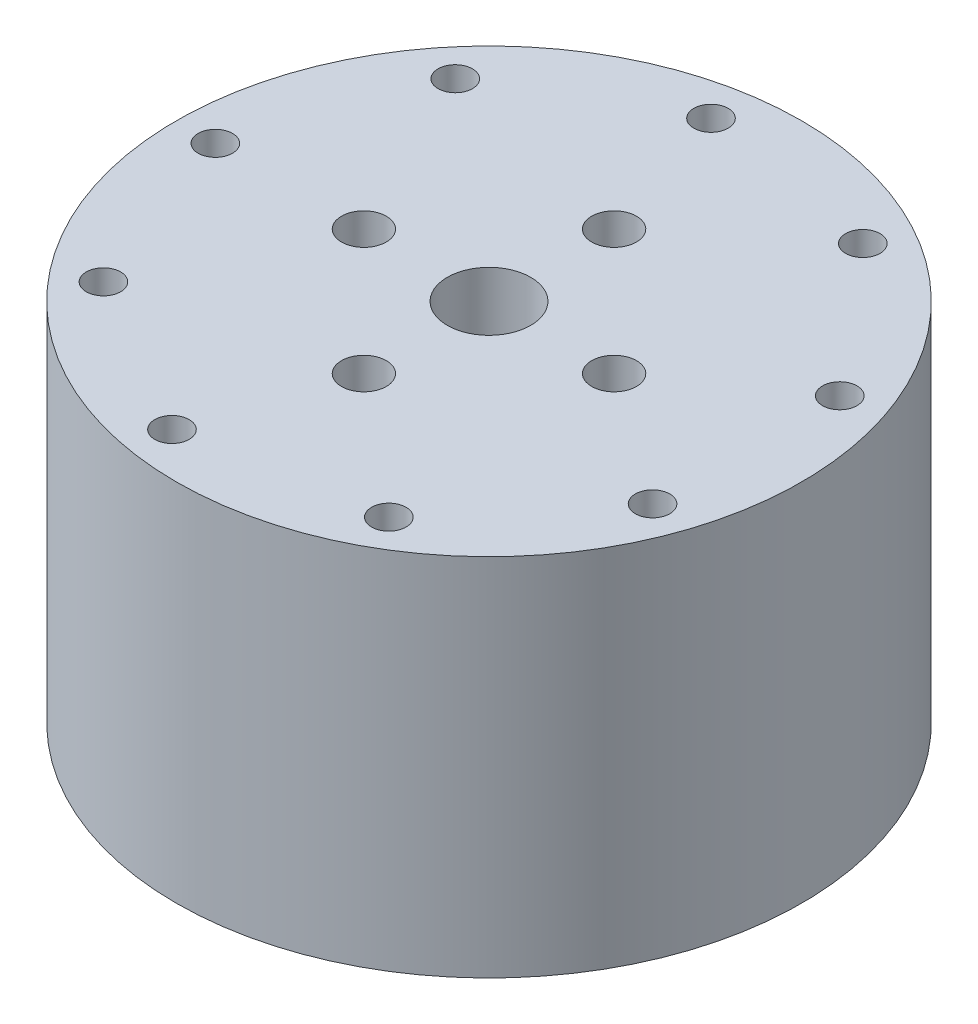
ISO-10303-21;
HEADER;
FILE_DESCRIPTION(('STEP AP214'),'2;1');
FILE_NAME('part.step','',(''),(''),'','','');
FILE_SCHEMA(('AUTOMOTIVE_DESIGN { 1 0 10303 214 1 1 1 1 }'));
ENDSEC;
DATA;
#1=APPLICATION_CONTEXT('core data for automotive mechanical design processes');
#2=APPLICATION_PROTOCOL_DEFINITION('international standard','automotive_design',2000,#1);
#3=PRODUCT_CONTEXT('',#1,'mechanical');
#4=PRODUCT('Part','Part','',(#3));
#5=PRODUCT_RELATED_PRODUCT_CATEGORY('part','',(#4));
#6=PRODUCT_DEFINITION_FORMATION('','',#4);
#7=PRODUCT_DEFINITION_CONTEXT('part definition',#1,'design');
#8=PRODUCT_DEFINITION('design','',#6,#7);
#9=PRODUCT_DEFINITION_SHAPE('','',#8);
#10=(LENGTH_UNIT() NAMED_UNIT(*) SI_UNIT(.MILLI.,.METRE.));
#11=(NAMED_UNIT(*) PLANE_ANGLE_UNIT() SI_UNIT($,.RADIAN.));
#12=(NAMED_UNIT(*) SI_UNIT($,.STERADIAN.) SOLID_ANGLE_UNIT());
#13=UNCERTAINTY_MEASURE_WITH_UNIT(LENGTH_MEASURE(1.E-05),#10,'distance_accuracy_value','');
#14=(GEOMETRIC_REPRESENTATION_CONTEXT(3) GLOBAL_UNCERTAINTY_ASSIGNED_CONTEXT((#13)) GLOBAL_UNIT_ASSIGNED_CONTEXT((#10,
#11,#12)) REPRESENTATION_CONTEXT('',''));
#15=CARTESIAN_POINT('',(0.,0.,0.));
#16=DIRECTION('',(0.,0.,1.));
#17=DIRECTION('',(1.,0.,0.));
#18=AXIS2_PLACEMENT_3D('',#15,#16,#17);
#19=CARTESIAN_POINT('',(0.,35.,0.));
#20=DIRECTION('',(0.,-1.,0.));
#21=DIRECTION('',(0.,0.,-1.));
#22=AXIS2_PLACEMENT_3D('',#19,#20,#21);
#23=CYLINDRICAL_SURFACE('',#22,30.);
#24=CARTESIAN_POINT('',(0.,35.,0.));
#25=DIRECTION('',(0.,1.,0.));
#26=DIRECTION('',(0.,0.,1.));
#27=AXIS2_PLACEMENT_3D('',#24,#25,#26);
#28=CIRCLE('',#27,30.);
#29=CARTESIAN_POINT('',(0.,35.,30.));
#30=VERTEX_POINT('',#29);
#31=EDGE_CURVE('E10',#30,#30,#28,.T.);
#32=ORIENTED_EDGE('',*,*,#31,.F.);
#33=EDGE_LOOP('',(#32));
#34=FACE_BOUND('',#33,.T.);
#35=CARTESIAN_POINT('',(0.,0.,0.));
#36=DIRECTION('',(0.,1.,0.));
#37=DIRECTION('',(0.,0.,1.));
#38=AXIS2_PLACEMENT_3D('',#35,#36,#37);
#39=CIRCLE('',#38,30.);
#40=CARTESIAN_POINT('',(0.,0.,30.));
#41=VERTEX_POINT('',#40);
#42=EDGE_CURVE('E36',#41,#41,#39,.T.);
#43=ORIENTED_EDGE('',*,*,#42,.T.);
#44=EDGE_LOOP('',(#43));
#45=FACE_BOUND('',#44,.T.);
#46=ADVANCED_FACE('F33',(#34,#45),#23,.T.);
#47=CARTESIAN_POINT('',(0.,35.,0.));
#48=DIRECTION('',(0.,1.,0.));
#49=DIRECTION('',(0.,0.,1.));
#50=AXIS2_PLACEMENT_3D('',#47,#48,#49);
#51=PLANE('',#50);
#52=CARTESIAN_POINT('',(0.,35.,12.));
#53=DIRECTION('',(0.,-1.,0.));
#54=DIRECTION('',(0.,0.,-1.));
#55=AXIS2_PLACEMENT_3D('',#52,#53,#54);
#56=CIRCLE('',#55,2.15);
#57=CARTESIAN_POINT('',(0.,35.,9.85));
#58=VERTEX_POINT('',#57);
#59=EDGE_CURVE('E108',#58,#58,#56,.T.);
#60=ORIENTED_EDGE('',*,*,#59,.T.);
#61=EDGE_LOOP('',(#60));
#62=FACE_BOUND('',#61,.T.);
#63=CARTESIAN_POINT('',(12.0000000000003,35.,3.39590937005871E-13));
#64=DIRECTION('',(0.,-1.,0.));
#65=DIRECTION('',(0.,0.,-1.));
#66=AXIS2_PLACEMENT_3D('',#63,#64,#65);
#67=CIRCLE('',#66,2.15000000000027);
#68=CARTESIAN_POINT('',(12.0000000000003,35.,-2.14999999999993));
#69=VERTEX_POINT('',#68);
#70=EDGE_CURVE('E126',#69,#69,#67,.T.);
#71=ORIENTED_EDGE('',*,*,#70,.T.);
#72=EDGE_LOOP('',(#71));
#73=FACE_BOUND('',#72,.T.);
#74=CARTESIAN_POINT('',(6.79181874011743E-13,35.,-12.));
#75=DIRECTION('',(0.,-1.,0.));
#76=DIRECTION('',(0.,0.,-1.));
#77=AXIS2_PLACEMENT_3D('',#74,#75,#76);
#78=CIRCLE('',#77,2.15000000000073);
#79=CARTESIAN_POINT('',(6.79181874011743E-13,35.,-14.1500000000007));
#80=VERTEX_POINT('',#79);
#81=EDGE_CURVE('E120',#80,#80,#78,.T.);
#82=ORIENTED_EDGE('',*,*,#81,.T.);
#83=EDGE_LOOP('',(#82));
#84=FACE_BOUND('',#83,.T.);
#85=CARTESIAN_POINT('',(-11.9999999999997,35.,-3.41060513164848E-13));
#86=DIRECTION('',(0.,-1.,0.));
#87=DIRECTION('',(0.,0.,-1.));
#88=AXIS2_PLACEMENT_3D('',#85,#86,#87);
#89=CIRCLE('',#88,2.15000000000055);
#90=CARTESIAN_POINT('',(-11.9999999999997,35.,-2.15000000000089));
#91=VERTEX_POINT('',#90);
#92=EDGE_CURVE('E114',#91,#91,#89,.T.);
#93=ORIENTED_EDGE('',*,*,#92,.T.);
#94=EDGE_LOOP('',(#93));
#95=FACE_BOUND('',#94,.T.);
#96=CARTESIAN_POINT('',(0.,35.,0.));
#97=DIRECTION('',(0.,-1.,0.));
#98=DIRECTION('',(0.,0.,-1.));
#99=AXIS2_PLACEMENT_3D('',#96,#97,#98);
#100=CIRCLE('',#99,4.);
#101=CARTESIAN_POINT('',(0.,35.,-4.));
#102=VERTEX_POINT('',#101);
#103=EDGE_CURVE('E102',#102,#102,#100,.T.);
#104=ORIENTED_EDGE('',*,*,#103,.T.);
#105=EDGE_LOOP('',(#104));
#106=FACE_BOUND('',#105,.T.);
#107=CARTESIAN_POINT('',(-26.25,35.,0.));
#108=DIRECTION('',(0.,-1.,0.));
#109=DIRECTION('',(0.,0.,-1.));
#110=AXIS2_PLACEMENT_3D('',#107,#108,#109);
#111=CIRCLE('',#110,1.65);
#112=CARTESIAN_POINT('',(-26.25,35.,-1.65));
#113=VERTEX_POINT('',#112);
#114=EDGE_CURVE('E43',#113,#113,#111,.T.);
#115=ORIENTED_EDGE('',*,*,#114,.T.);
#116=EDGE_LOOP('',(#115));
#117=FACE_BOUND('',#116,.T.);
#118=CARTESIAN_POINT('',(-20.1086666318732,35.,16.8731747542717));
#119=DIRECTION('',(0.,-1.,0.));
#120=DIRECTION('',(0.,0.,-1.));
#121=AXIS2_PLACEMENT_3D('',#118,#119,#120);
#122=CIRCLE('',#121,1.65);
#123=CARTESIAN_POINT('',(-20.1086666318732,35.,15.2231747542717));
#124=VERTEX_POINT('',#123);
#125=EDGE_CURVE('E91',#124,#124,#122,.T.);
#126=ORIENTED_EDGE('',*,*,#125,.T.);
#127=EDGE_LOOP('',(#126));
#128=FACE_BOUND('',#127,.T.);
#129=CARTESIAN_POINT('',(-4.55826466375685,35.,25.8512035165705));
#130=DIRECTION('',(0.,-1.,0.));
#131=DIRECTION('',(0.,0.,-1.));
#132=AXIS2_PLACEMENT_3D('',#129,#130,#131);
#133=CIRCLE('',#132,1.65);
#134=CARTESIAN_POINT('',(-4.55826466375685,35.,24.2012035165705));
#135=VERTEX_POINT('',#134);
#136=EDGE_CURVE('E85',#135,#135,#133,.T.);
#137=ORIENTED_EDGE('',*,*,#136,.T.);
#138=EDGE_LOOP('',(#137));
#139=FACE_BOUND('',#138,.T.);
#140=CARTESIAN_POINT('',(13.1250000000001,35.,22.7331668493415));
#141=DIRECTION('',(0.,-1.,0.));
#142=DIRECTION('',(0.,0.,-1.));
#143=AXIS2_PLACEMENT_3D('',#140,#141,#142);
#144=CIRCLE('',#143,1.65);
#145=CARTESIAN_POINT('',(13.1250000000001,35.,21.0831668493415));
#146=VERTEX_POINT('',#145);
#147=EDGE_CURVE('E79',#146,#146,#144,.T.);
#148=ORIENTED_EDGE('',*,*,#147,.T.);
#149=EDGE_LOOP('',(#148));
#150=FACE_BOUND('',#149,.T.);
#151=CARTESIAN_POINT('',(24.6669312956301,35.,8.97802876229866));
#152=DIRECTION('',(0.,-1.,0.));
#153=DIRECTION('',(0.,0.,-1.));
#154=AXIS2_PLACEMENT_3D('',#151,#152,#153);
#155=CIRCLE('',#154,1.65);
#156=CARTESIAN_POINT('',(24.6669312956301,35.,7.32802876229866));
#157=VERTEX_POINT('',#156);
#158=EDGE_CURVE('E73',#157,#157,#155,.T.);
#159=ORIENTED_EDGE('',*,*,#158,.T.);
#160=EDGE_LOOP('',(#159));
#161=FACE_BOUND('',#160,.T.);
#162=CARTESIAN_POINT('',(24.66693129563,35.,-8.97802876229899));
#163=DIRECTION('',(0.,-1.,0.));
#164=DIRECTION('',(0.,0.,-1.));
#165=AXIS2_PLACEMENT_3D('',#162,#163,#164);
#166=CIRCLE('',#165,1.65);
#167=CARTESIAN_POINT('',(24.66693129563,35.,-10.628028762299));
#168=VERTEX_POINT('',#167);
#169=EDGE_CURVE('E67',#168,#168,#166,.T.);
#170=ORIENTED_EDGE('',*,*,#169,.T.);
#171=EDGE_LOOP('',(#170));
#172=FACE_BOUND('',#171,.T.);
#173=CARTESIAN_POINT('',(13.1249999999998,35.,-22.7331668493416));
#174=DIRECTION('',(0.,-1.,0.));
#175=DIRECTION('',(0.,0.,-1.));
#176=AXIS2_PLACEMENT_3D('',#173,#174,#175);
#177=CIRCLE('',#176,1.65);
#178=CARTESIAN_POINT('',(13.1249999999998,35.,-24.3831668493416));
#179=VERTEX_POINT('',#178);
#180=EDGE_CURVE('E61',#179,#179,#177,.T.);
#181=ORIENTED_EDGE('',*,*,#180,.T.);
#182=EDGE_LOOP('',(#181));
#183=FACE_BOUND('',#182,.T.);
#184=CARTESIAN_POINT('',(-4.55826466375719,35.,-25.8512035165704));
#185=DIRECTION('',(0.,-1.,0.));
#186=DIRECTION('',(0.,0.,-1.));
#187=AXIS2_PLACEMENT_3D('',#184,#185,#186);
#188=CIRCLE('',#187,1.65);
#189=CARTESIAN_POINT('',(-4.55826466375719,35.,-27.5012035165704));
#190=VERTEX_POINT('',#189);
#191=EDGE_CURVE('E55',#190,#190,#188,.T.);
#192=ORIENTED_EDGE('',*,*,#191,.T.);
#193=EDGE_LOOP('',(#192));
#194=FACE_BOUND('',#193,.T.);
#195=CARTESIAN_POINT('',(-20.1086666318734,35.,-16.8731747542714));
#196=DIRECTION('',(0.,-1.,0.));
#197=DIRECTION('',(0.,0.,-1.));
#198=AXIS2_PLACEMENT_3D('',#195,#196,#197);
#199=CIRCLE('',#198,1.65);
#200=CARTESIAN_POINT('',(-20.1086666318734,35.,-18.5231747542714));
#201=VERTEX_POINT('',#200);
#202=EDGE_CURVE('E48',#201,#201,#199,.T.);
#203=ORIENTED_EDGE('',*,*,#202,.T.);
#204=EDGE_LOOP('',(#203));
#205=FACE_BOUND('',#204,.T.);
#206=ORIENTED_EDGE('',*,*,#31,.T.);
#207=EDGE_LOOP('',(#206));
#208=FACE_BOUND('',#207,.T.);
#209=ADVANCED_FACE('F135',(#62,#73,#84,#95,#106,#117,#128,#139,#150,#161,#172,#183,#194,#205,
#208),#51,.T.);
#210=CARTESIAN_POINT('',(0.,0.,0.));
#211=DIRECTION('',(0.,1.,0.));
#212=DIRECTION('',(0.,0.,1.));
#213=AXIS2_PLACEMENT_3D('',#210,#211,#212);
#214=PLANE('',#213);
#215=CARTESIAN_POINT('',(0.,0.,0.));
#216=DIRECTION('',(0.,-1.,0.));
#217=DIRECTION('',(0.,0.,-1.));
#218=AXIS2_PLACEMENT_3D('',#215,#216,#217);
#219=CIRCLE('',#218,20.);
#220=CARTESIAN_POINT('',(0.,0.,-20.));
#221=VERTEX_POINT('',#220);
#222=EDGE_CURVE('E99',#221,#221,#219,.T.);
#223=ORIENTED_EDGE('',*,*,#222,.F.);
#224=EDGE_LOOP('',(#223));
#225=FACE_BOUND('',#224,.T.);
#226=CARTESIAN_POINT('',(-26.25,0.,0.));
#227=DIRECTION('',(0.,-1.,0.));
#228=DIRECTION('',(0.,0.,-1.));
#229=AXIS2_PLACEMENT_3D('',#226,#227,#228);
#230=CIRCLE('',#229,1.65);
#231=CARTESIAN_POINT('',(-26.25,0.,-1.65));
#232=VERTEX_POINT('',#231);
#233=EDGE_CURVE('E94',#232,#232,#230,.T.);
#234=ORIENTED_EDGE('',*,*,#233,.F.);
#235=EDGE_LOOP('',(#234));
#236=FACE_BOUND('',#235,.T.);
#237=CARTESIAN_POINT('',(-20.1086666318732,0.,16.8731747542717));
#238=DIRECTION('',(0.,-1.,0.));
#239=DIRECTION('',(0.,0.,-1.));
#240=AXIS2_PLACEMENT_3D('',#237,#238,#239);
#241=CIRCLE('',#240,1.65);
#242=CARTESIAN_POINT('',(-20.1086666318732,0.,15.2231747542717));
#243=VERTEX_POINT('',#242);
#244=EDGE_CURVE('E88',#243,#243,#241,.T.);
#245=ORIENTED_EDGE('',*,*,#244,.F.);
#246=EDGE_LOOP('',(#245));
#247=FACE_BOUND('',#246,.T.);
#248=CARTESIAN_POINT('',(-4.55826466375685,0.,25.8512035165705));
#249=DIRECTION('',(0.,-1.,0.));
#250=DIRECTION('',(0.,0.,-1.));
#251=AXIS2_PLACEMENT_3D('',#248,#249,#250);
#252=CIRCLE('',#251,1.65);
#253=CARTESIAN_POINT('',(-4.55826466375685,0.,24.2012035165705));
#254=VERTEX_POINT('',#253);
#255=EDGE_CURVE('E82',#254,#254,#252,.T.);
#256=ORIENTED_EDGE('',*,*,#255,.F.);
#257=EDGE_LOOP('',(#256));
#258=FACE_BOUND('',#257,.T.);
#259=CARTESIAN_POINT('',(13.1250000000001,0.,22.7331668493415));
#260=DIRECTION('',(0.,-1.,0.));
#261=DIRECTION('',(0.,0.,-1.));
#262=AXIS2_PLACEMENT_3D('',#259,#260,#261);
#263=CIRCLE('',#262,1.65);
#264=CARTESIAN_POINT('',(13.1250000000001,0.,21.0831668493415));
#265=VERTEX_POINT('',#264);
#266=EDGE_CURVE('E76',#265,#265,#263,.T.);
#267=ORIENTED_EDGE('',*,*,#266,.F.);
#268=EDGE_LOOP('',(#267));
#269=FACE_BOUND('',#268,.T.);
#270=CARTESIAN_POINT('',(24.6669312956301,0.,8.97802876229866));
#271=DIRECTION('',(0.,-1.,0.));
#272=DIRECTION('',(0.,0.,-1.));
#273=AXIS2_PLACEMENT_3D('',#270,#271,#272);
#274=CIRCLE('',#273,1.65);
#275=CARTESIAN_POINT('',(24.6669312956301,0.,7.32802876229866));
#276=VERTEX_POINT('',#275);
#277=EDGE_CURVE('E70',#276,#276,#274,.T.);
#278=ORIENTED_EDGE('',*,*,#277,.F.);
#279=EDGE_LOOP('',(#278));
#280=FACE_BOUND('',#279,.T.);
#281=CARTESIAN_POINT('',(24.66693129563,0.,-8.97802876229899));
#282=DIRECTION('',(0.,-1.,0.));
#283=DIRECTION('',(0.,0.,-1.));
#284=AXIS2_PLACEMENT_3D('',#281,#282,#283);
#285=CIRCLE('',#284,1.65);
#286=CARTESIAN_POINT('',(24.66693129563,0.,-10.628028762299));
#287=VERTEX_POINT('',#286);
#288=EDGE_CURVE('E64',#287,#287,#285,.T.);
#289=ORIENTED_EDGE('',*,*,#288,.F.);
#290=EDGE_LOOP('',(#289));
#291=FACE_BOUND('',#290,.T.);
#292=CARTESIAN_POINT('',(13.1249999999998,0.,-22.7331668493416));
#293=DIRECTION('',(0.,-1.,0.));
#294=DIRECTION('',(0.,0.,-1.));
#295=AXIS2_PLACEMENT_3D('',#292,#293,#294);
#296=CIRCLE('',#295,1.65);
#297=CARTESIAN_POINT('',(13.1249999999998,0.,-24.3831668493416));
#298=VERTEX_POINT('',#297);
#299=EDGE_CURVE('E58',#298,#298,#296,.T.);
#300=ORIENTED_EDGE('',*,*,#299,.F.);
#301=EDGE_LOOP('',(#300));
#302=FACE_BOUND('',#301,.T.);
#303=CARTESIAN_POINT('',(-4.55826466375719,0.,-25.8512035165704));
#304=DIRECTION('',(0.,-1.,0.));
#305=DIRECTION('',(0.,0.,-1.));
#306=AXIS2_PLACEMENT_3D('',#303,#304,#305);
#307=CIRCLE('',#306,1.65);
#308=CARTESIAN_POINT('',(-4.55826466375719,0.,-27.5012035165704));
#309=VERTEX_POINT('',#308);
#310=EDGE_CURVE('E52',#309,#309,#307,.T.);
#311=ORIENTED_EDGE('',*,*,#310,.F.);
#312=EDGE_LOOP('',(#311));
#313=FACE_BOUND('',#312,.T.);
#314=CARTESIAN_POINT('',(-20.1086666318734,0.,-16.8731747542714));
#315=DIRECTION('',(0.,-1.,0.));
#316=DIRECTION('',(0.,0.,-1.));
#317=AXIS2_PLACEMENT_3D('',#314,#315,#316);
#318=CIRCLE('',#317,1.65);
#319=CARTESIAN_POINT('',(-20.1086666318734,0.,-18.5231747542714));
#320=VERTEX_POINT('',#319);
#321=EDGE_CURVE('E45',#320,#320,#318,.T.);
#322=ORIENTED_EDGE('',*,*,#321,.F.);
#323=EDGE_LOOP('',(#322));
#324=FACE_BOUND('',#323,.T.);
#325=ORIENTED_EDGE('',*,*,#42,.F.);
#326=EDGE_LOOP('',(#325));
#327=FACE_BOUND('',#326,.T.);
#328=ADVANCED_FACE('F167',(#225,#236,#247,#258,#269,#280,#291,#302,#313,#324,#327),#214,.F.);
#329=CARTESIAN_POINT('',(-20.1086666318734,35.,-16.8731747542714));
#330=DIRECTION('',(0.,-1.,0.));
#331=DIRECTION('',(0.,0.,-1.));
#332=AXIS2_PLACEMENT_3D('',#329,#330,#331);
#333=CYLINDRICAL_SURFACE('',#332,1.65);
#334=ORIENTED_EDGE('',*,*,#202,.F.);
#335=EDGE_LOOP('',(#334));
#336=FACE_BOUND('',#335,.T.);
#337=ORIENTED_EDGE('',*,*,#321,.T.);
#338=EDGE_LOOP('',(#337));
#339=FACE_BOUND('',#338,.T.);
#340=ADVANCED_FACE('F170',(#336,#339),#333,.F.);
#341=CARTESIAN_POINT('',(-4.55826466375719,35.,-25.8512035165704));
#342=DIRECTION('',(0.,-1.,0.));
#343=DIRECTION('',(0.,0.,-1.));
#344=AXIS2_PLACEMENT_3D('',#341,#342,#343);
#345=CYLINDRICAL_SURFACE('',#344,1.65);
#346=ORIENTED_EDGE('',*,*,#191,.F.);
#347=EDGE_LOOP('',(#346));
#348=FACE_BOUND('',#347,.T.);
#349=ORIENTED_EDGE('',*,*,#310,.T.);
#350=EDGE_LOOP('',(#349));
#351=FACE_BOUND('',#350,.T.);
#352=ADVANCED_FACE('F202',(#348,#351),#345,.F.);
#353=CARTESIAN_POINT('',(13.1249999999998,35.,-22.7331668493416));
#354=DIRECTION('',(0.,-1.,0.));
#355=DIRECTION('',(0.,0.,-1.));
#356=AXIS2_PLACEMENT_3D('',#353,#354,#355);
#357=CYLINDRICAL_SURFACE('',#356,1.65);
#358=ORIENTED_EDGE('',*,*,#180,.F.);
#359=EDGE_LOOP('',(#358));
#360=FACE_BOUND('',#359,.T.);
#361=ORIENTED_EDGE('',*,*,#299,.T.);
#362=EDGE_LOOP('',(#361));
#363=FACE_BOUND('',#362,.T.);
#364=ADVANCED_FACE('F206',(#360,#363),#357,.F.);
#365=CARTESIAN_POINT('',(24.66693129563,35.,-8.97802876229899));
#366=DIRECTION('',(0.,-1.,0.));
#367=DIRECTION('',(0.,0.,-1.));
#368=AXIS2_PLACEMENT_3D('',#365,#366,#367);
#369=CYLINDRICAL_SURFACE('',#368,1.65);
#370=ORIENTED_EDGE('',*,*,#169,.F.);
#371=EDGE_LOOP('',(#370));
#372=FACE_BOUND('',#371,.T.);
#373=ORIENTED_EDGE('',*,*,#288,.T.);
#374=EDGE_LOOP('',(#373));
#375=FACE_BOUND('',#374,.T.);
#376=ADVANCED_FACE('F210',(#372,#375),#369,.F.);
#377=CARTESIAN_POINT('',(24.6669312956301,35.,8.97802876229866));
#378=DIRECTION('',(0.,-1.,0.));
#379=DIRECTION('',(0.,0.,-1.));
#380=AXIS2_PLACEMENT_3D('',#377,#378,#379);
#381=CYLINDRICAL_SURFACE('',#380,1.65);
#382=ORIENTED_EDGE('',*,*,#158,.F.);
#383=EDGE_LOOP('',(#382));
#384=FACE_BOUND('',#383,.T.);
#385=ORIENTED_EDGE('',*,*,#277,.T.);
#386=EDGE_LOOP('',(#385));
#387=FACE_BOUND('',#386,.T.);
#388=ADVANCED_FACE('F214',(#384,#387),#381,.F.);
#389=CARTESIAN_POINT('',(13.1250000000001,35.,22.7331668493415));
#390=DIRECTION('',(0.,-1.,0.));
#391=DIRECTION('',(0.,0.,-1.));
#392=AXIS2_PLACEMENT_3D('',#389,#390,#391);
#393=CYLINDRICAL_SURFACE('',#392,1.65);
#394=ORIENTED_EDGE('',*,*,#147,.F.);
#395=EDGE_LOOP('',(#394));
#396=FACE_BOUND('',#395,.T.);
#397=ORIENTED_EDGE('',*,*,#266,.T.);
#398=EDGE_LOOP('',(#397));
#399=FACE_BOUND('',#398,.T.);
#400=ADVANCED_FACE('F218',(#396,#399),#393,.F.);
#401=CARTESIAN_POINT('',(-4.55826466375685,35.,25.8512035165705));
#402=DIRECTION('',(0.,-1.,0.));
#403=DIRECTION('',(0.,0.,-1.));
#404=AXIS2_PLACEMENT_3D('',#401,#402,#403);
#405=CYLINDRICAL_SURFACE('',#404,1.65);
#406=ORIENTED_EDGE('',*,*,#136,.F.);
#407=EDGE_LOOP('',(#406));
#408=FACE_BOUND('',#407,.T.);
#409=ORIENTED_EDGE('',*,*,#255,.T.);
#410=EDGE_LOOP('',(#409));
#411=FACE_BOUND('',#410,.T.);
#412=ADVANCED_FACE('F222',(#408,#411),#405,.F.);
#413=CARTESIAN_POINT('',(-20.1086666318732,35.,16.8731747542717));
#414=DIRECTION('',(0.,-1.,0.));
#415=DIRECTION('',(0.,0.,-1.));
#416=AXIS2_PLACEMENT_3D('',#413,#414,#415);
#417=CYLINDRICAL_SURFACE('',#416,1.65);
#418=ORIENTED_EDGE('',*,*,#125,.F.);
#419=EDGE_LOOP('',(#418));
#420=FACE_BOUND('',#419,.T.);
#421=ORIENTED_EDGE('',*,*,#244,.T.);
#422=EDGE_LOOP('',(#421));
#423=FACE_BOUND('',#422,.T.);
#424=ADVANCED_FACE('F226',(#420,#423),#417,.F.);
#425=CARTESIAN_POINT('',(-26.25,35.,0.));
#426=DIRECTION('',(0.,-1.,0.));
#427=DIRECTION('',(0.,0.,-1.));
#428=AXIS2_PLACEMENT_3D('',#425,#426,#427);
#429=CYLINDRICAL_SURFACE('',#428,1.65);
#430=ORIENTED_EDGE('',*,*,#114,.F.);
#431=EDGE_LOOP('',(#430));
#432=FACE_BOUND('',#431,.T.);
#433=ORIENTED_EDGE('',*,*,#233,.T.);
#434=EDGE_LOOP('',(#433));
#435=FACE_BOUND('',#434,.T.);
#436=ADVANCED_FACE('F163',(#432,#435),#429,.F.);
#437=CARTESIAN_POINT('',(0.,10.,0.));
#438=DIRECTION('',(0.,-1.,0.));
#439=DIRECTION('',(0.,0.,-1.));
#440=AXIS2_PLACEMENT_3D('',#437,#438,#439);
#441=CYLINDRICAL_SURFACE('',#440,20.);
#442=CARTESIAN_POINT('',(0.,10.,0.));
#443=DIRECTION('',(0.,-1.,0.));
#444=DIRECTION('',(0.,0.,-1.));
#445=AXIS2_PLACEMENT_3D('',#442,#443,#444);
#446=CIRCLE('',#445,20.);
#447=CARTESIAN_POINT('',(0.,10.,-20.));
#448=VERTEX_POINT('',#447);
#449=EDGE_CURVE('E49',#448,#448,#446,.T.);
#450=ORIENTED_EDGE('',*,*,#449,.F.);
#451=EDGE_LOOP('',(#450));
#452=FACE_BOUND('',#451,.T.);
#453=ORIENTED_EDGE('',*,*,#222,.T.);
#454=EDGE_LOOP('',(#453));
#455=FACE_BOUND('',#454,.T.);
#456=ADVANCED_FACE('F149',(#452,#455),#441,.F.);
#457=CARTESIAN_POINT('',(0.,10.,0.));
#458=DIRECTION('',(0.,-1.,0.));
#459=DIRECTION('',(0.,0.,-1.));
#460=AXIS2_PLACEMENT_3D('',#457,#458,#459);
#461=PLANE('',#460);
#462=CARTESIAN_POINT('',(0.,10.,12.));
#463=DIRECTION('',(0.,-1.,0.));
#464=DIRECTION('',(0.,0.,-1.));
#465=AXIS2_PLACEMENT_3D('',#462,#463,#464);
#466=CIRCLE('',#465,2.15);
#467=CARTESIAN_POINT('',(0.,10.,9.85));
#468=VERTEX_POINT('',#467);
#469=EDGE_CURVE('E129',#468,#468,#466,.T.);
#470=ORIENTED_EDGE('',*,*,#469,.F.);
#471=EDGE_LOOP('',(#470));
#472=FACE_BOUND('',#471,.T.);
#473=CARTESIAN_POINT('',(12.0000000000003,10.,3.39590937005871E-13));
#474=DIRECTION('',(0.,-1.,0.));
#475=DIRECTION('',(0.,0.,-1.));
#476=AXIS2_PLACEMENT_3D('',#473,#474,#475);
#477=CIRCLE('',#476,2.15000000000027);
#478=CARTESIAN_POINT('',(12.0000000000003,10.,-2.14999999999993));
#479=VERTEX_POINT('',#478);
#480=EDGE_CURVE('E123',#479,#479,#477,.T.);
#481=ORIENTED_EDGE('',*,*,#480,.F.);
#482=EDGE_LOOP('',(#481));
#483=FACE_BOUND('',#482,.T.);
#484=CARTESIAN_POINT('',(6.79181874011743E-13,10.,-12.));
#485=DIRECTION('',(0.,-1.,0.));
#486=DIRECTION('',(0.,0.,-1.));
#487=AXIS2_PLACEMENT_3D('',#484,#485,#486);
#488=CIRCLE('',#487,2.15000000000073);
#489=CARTESIAN_POINT('',(6.79181874011743E-13,10.,-14.1500000000007));
#490=VERTEX_POINT('',#489);
#491=EDGE_CURVE('E117',#490,#490,#488,.T.);
#492=ORIENTED_EDGE('',*,*,#491,.F.);
#493=EDGE_LOOP('',(#492));
#494=FACE_BOUND('',#493,.T.);
#495=CARTESIAN_POINT('',(-11.9999999999997,10.,-3.41060513164848E-13));
#496=DIRECTION('',(0.,-1.,0.));
#497=DIRECTION('',(0.,0.,-1.));
#498=AXIS2_PLACEMENT_3D('',#495,#496,#497);
#499=CIRCLE('',#498,2.15000000000055);
#500=CARTESIAN_POINT('',(-11.9999999999997,10.,-2.15000000000089));
#501=VERTEX_POINT('',#500);
#502=EDGE_CURVE('E111',#501,#501,#499,.T.);
#503=ORIENTED_EDGE('',*,*,#502,.F.);
#504=EDGE_LOOP('',(#503));
#505=FACE_BOUND('',#504,.T.);
#506=CARTESIAN_POINT('',(0.,10.,0.));
#507=DIRECTION('',(0.,-1.,0.));
#508=DIRECTION('',(0.,0.,-1.));
#509=AXIS2_PLACEMENT_3D('',#506,#507,#508);
#510=CIRCLE('',#509,4.);
#511=CARTESIAN_POINT('',(0.,10.,-4.));
#512=VERTEX_POINT('',#511);
#513=EDGE_CURVE('E105',#512,#512,#510,.T.);
#514=ORIENTED_EDGE('',*,*,#513,.F.);
#515=EDGE_LOOP('',(#514));
#516=FACE_BOUND('',#515,.T.);
#517=ORIENTED_EDGE('',*,*,#449,.T.);
#518=EDGE_LOOP('',(#517));
#519=FACE_BOUND('',#518,.T.);
#520=ADVANCED_FACE('F145',(#472,#483,#494,#505,#516,#519),#461,.T.);
#521=CARTESIAN_POINT('',(0.,35.,0.));
#522=DIRECTION('',(0.,-1.,0.));
#523=DIRECTION('',(0.,0.,-1.));
#524=AXIS2_PLACEMENT_3D('',#521,#522,#523);
#525=CYLINDRICAL_SURFACE('',#524,4.);
#526=ORIENTED_EDGE('',*,*,#103,.F.);
#527=EDGE_LOOP('',(#526));
#528=FACE_BOUND('',#527,.T.);
#529=ORIENTED_EDGE('',*,*,#513,.T.);
#530=EDGE_LOOP('',(#529));
#531=FACE_BOUND('',#530,.T.);
#532=ADVANCED_FACE('F148',(#528,#531),#525,.F.);
#533=CARTESIAN_POINT('',(-11.9999999999997,35.,-3.41060513164848E-13));
#534=DIRECTION('',(0.,-1.,0.));
#535=DIRECTION('',(0.,0.,-1.));
#536=AXIS2_PLACEMENT_3D('',#533,#534,#535);
#537=CYLINDRICAL_SURFACE('',#536,2.15000000000055);
#538=ORIENTED_EDGE('',*,*,#92,.F.);
#539=EDGE_LOOP('',(#538));
#540=FACE_BOUND('',#539,.T.);
#541=ORIENTED_EDGE('',*,*,#502,.T.);
#542=EDGE_LOOP('',(#541));
#543=FACE_BOUND('',#542,.T.);
#544=ADVANCED_FACE('F236',(#540,#543),#537,.F.);
#545=CARTESIAN_POINT('',(6.79181874011743E-13,35.,-12.));
#546=DIRECTION('',(0.,-1.,0.));
#547=DIRECTION('',(0.,0.,-1.));
#548=AXIS2_PLACEMENT_3D('',#545,#546,#547);
#549=CYLINDRICAL_SURFACE('',#548,2.15000000000073);
#550=ORIENTED_EDGE('',*,*,#81,.F.);
#551=EDGE_LOOP('',(#550));
#552=FACE_BOUND('',#551,.T.);
#553=ORIENTED_EDGE('',*,*,#491,.T.);
#554=EDGE_LOOP('',(#553));
#555=FACE_BOUND('',#554,.T.);
#556=ADVANCED_FACE('F240',(#552,#555),#549,.F.);
#557=CARTESIAN_POINT('',(12.0000000000003,35.,3.39590937005871E-13));
#558=DIRECTION('',(0.,-1.,0.));
#559=DIRECTION('',(0.,0.,-1.));
#560=AXIS2_PLACEMENT_3D('',#557,#558,#559);
#561=CYLINDRICAL_SURFACE('',#560,2.15000000000027);
#562=ORIENTED_EDGE('',*,*,#70,.F.);
#563=EDGE_LOOP('',(#562));
#564=FACE_BOUND('',#563,.T.);
#565=ORIENTED_EDGE('',*,*,#480,.T.);
#566=EDGE_LOOP('',(#565));
#567=FACE_BOUND('',#566,.T.);
#568=ADVANCED_FACE('F141',(#564,#567),#561,.F.);
#569=CARTESIAN_POINT('',(0.,35.,12.));
#570=DIRECTION('',(0.,-1.,0.));
#571=DIRECTION('',(0.,0.,-1.));
#572=AXIS2_PLACEMENT_3D('',#569,#570,#571);
#573=CYLINDRICAL_SURFACE('',#572,2.15);
#574=ORIENTED_EDGE('',*,*,#59,.F.);
#575=EDGE_LOOP('',(#574));
#576=FACE_BOUND('',#575,.T.);
#577=ORIENTED_EDGE('',*,*,#469,.T.);
#578=EDGE_LOOP('',(#577));
#579=FACE_BOUND('',#578,.T.);
#580=ADVANCED_FACE('F138',(#576,#579),#573,.F.);
#581=CLOSED_SHELL('',(#46,#209,#328,#340,#352,#364,#376,#388,#400,#412,#424,#436,#456,#520,#532,
#544,#556,#568,#580));
#582=MANIFOLD_SOLID_BREP('B2',#581);
#583=ADVANCED_BREP_SHAPE_REPRESENTATION('',(#18,#582),#14);
#584=SHAPE_DEFINITION_REPRESENTATION(#9,#583);
ENDSEC;
END-ISO-10303-21;
